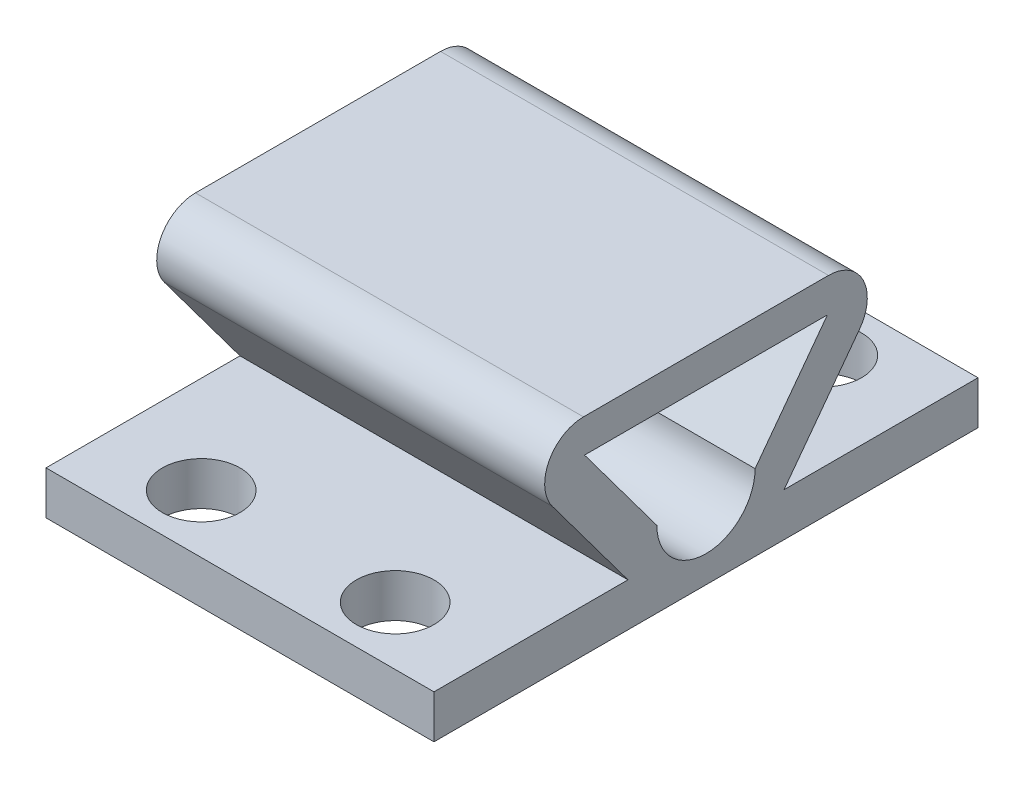
ISO-10303-21;
HEADER;
FILE_DESCRIPTION(('STEP AP214'),'2;1');
FILE_NAME('part.step','',(''),(''),'','','');
FILE_SCHEMA(('AUTOMOTIVE_DESIGN { 1 0 10303 214 1 1 1 1 }'));
ENDSEC;
DATA;
#1=APPLICATION_CONTEXT('core data for automotive mechanical design processes');
#2=APPLICATION_PROTOCOL_DEFINITION('international standard','automotive_design',2000,#1);
#3=PRODUCT_CONTEXT('',#1,'mechanical');
#4=PRODUCT('Part','Part','',(#3));
#5=PRODUCT_RELATED_PRODUCT_CATEGORY('part','',(#4));
#6=PRODUCT_DEFINITION_FORMATION('','',#4);
#7=PRODUCT_DEFINITION_CONTEXT('part definition',#1,'design');
#8=PRODUCT_DEFINITION('design','',#6,#7);
#9=PRODUCT_DEFINITION_SHAPE('','',#8);
#10=(LENGTH_UNIT() NAMED_UNIT(*) SI_UNIT(.MILLI.,.METRE.));
#11=(NAMED_UNIT(*) PLANE_ANGLE_UNIT() SI_UNIT($,.RADIAN.));
#12=(NAMED_UNIT(*) SI_UNIT($,.STERADIAN.) SOLID_ANGLE_UNIT());
#13=UNCERTAINTY_MEASURE_WITH_UNIT(LENGTH_MEASURE(1.E-05),#10,'distance_accuracy_value','');
#14=(GEOMETRIC_REPRESENTATION_CONTEXT(3) GLOBAL_UNCERTAINTY_ASSIGNED_CONTEXT((#13)) GLOBAL_UNIT_ASSIGNED_CONTEXT((#10,
#11,#12)) REPRESENTATION_CONTEXT('',''));
#15=CARTESIAN_POINT('',(0.,0.,0.));
#16=DIRECTION('',(0.,0.,1.));
#17=DIRECTION('',(1.,0.,0.));
#18=AXIS2_PLACEMENT_3D('',#15,#16,#17);
#19=CARTESIAN_POINT('',(25.4,-16.0818556559255,0.));
#20=DIRECTION('',(-1.,0.,0.));
#21=DIRECTION('',(0.,0.,1.));
#22=AXIS2_PLACEMENT_3D('',#19,#20,#21);
#23=CYLINDRICAL_SURFACE('',#22,3.21637113118511);
#24=CARTESIAN_POINT('',(2.54,-16.0818556559255,0.));
#25=DIRECTION('',(1.,0.,0.));
#26=DIRECTION('',(0.,0.,-1.));
#27=AXIS2_PLACEMENT_3D('',#24,#25,#26);
#28=CIRCLE('',#27,3.21637113118511);
#29=CARTESIAN_POINT('',(2.54,-16.0818556559255,3.21637113118511));
#30=VERTEX_POINT('',#29);
#31=CARTESIAN_POINT('',(2.54,-16.0818556559255,-3.21637113118511));
#32=VERTEX_POINT('',#31);
#33=EDGE_CURVE('E138',#30,#32,#28,.T.);
#34=ORIENTED_EDGE('',*,*,#33,.F.);
#35=DIRECTION('',(-1.,0.,0.));
#36=VECTOR('',#35,1.);
#37=CARTESIAN_POINT('',(25.4,-16.0818556559255,3.21637113118511));
#38=LINE('',#37,#36);
#39=CARTESIAN_POINT('',(25.4,-16.0818556559255,3.21637113118511));
#40=VERTEX_POINT('',#39);
#41=EDGE_CURVE('E150',#40,#30,#38,.T.);
#42=ORIENTED_EDGE('',*,*,#41,.F.);
#43=CARTESIAN_POINT('',(25.4,-16.0818556559255,0.));
#44=DIRECTION('',(1.,0.,0.));
#45=DIRECTION('',(0.,0.,-1.));
#46=AXIS2_PLACEMENT_3D('',#43,#44,#45);
#47=CIRCLE('',#46,3.21637113118511);
#48=CARTESIAN_POINT('',(25.4,-16.0818556559255,-3.21637113118511));
#49=VERTEX_POINT('',#48);
#50=EDGE_CURVE('E281',#40,#49,#47,.T.);
#51=ORIENTED_EDGE('',*,*,#50,.T.);
#52=DIRECTION('',(-1.,0.,0.));
#53=VECTOR('',#52,1.);
#54=CARTESIAN_POINT('',(25.4,-16.0818556559255,-3.21637113118511));
#55=LINE('',#54,#53);
#56=EDGE_CURVE('E153',#49,#32,#55,.T.);
#57=ORIENTED_EDGE('',*,*,#56,.T.);
#58=EDGE_LOOP('',(#34,#42,#51,#57));
#59=FACE_BOUND('',#58,.T.);
#60=ADVANCED_FACE('F37',(#59),#23,.F.);
#61=CARTESIAN_POINT('',(25.4,-7.28576497869708,9.77350921006466));
#62=DIRECTION('',(0.,0.597668162753968,-0.801743579475568));
#63=DIRECTION('',(0.,0.801743579475568,0.597668162753968));
#64=AXIS2_PLACEMENT_3D('',#61,#62,#63);
#65=PLANE('',#64);
#66=DIRECTION('',(0.,-0.801743579475568,-0.597668162753968));
#67=VECTOR('',#66,1.);
#68=CARTESIAN_POINT('',(2.54,-9.73185565592554,7.95004525174394));
#69=LINE('',#68,#67);
#70=CARTESIAN_POINT('',(2.54,-9.73185565592554,7.95004525174394));
#71=VERTEX_POINT('',#70);
#72=EDGE_CURVE('E135',#71,#30,#69,.T.);
#73=ORIENTED_EDGE('',*,*,#72,.F.);
#74=DIRECTION('',(-1.,0.,0.));
#75=VECTOR('',#74,1.);
#76=CARTESIAN_POINT('',(25.4,-9.73185565592554,7.95004525174394));
#77=LINE('',#76,#75);
#78=CARTESIAN_POINT('',(25.4,-9.73185565592554,7.95004525174394));
#79=VERTEX_POINT('',#78);
#80=EDGE_CURVE('E161',#79,#71,#77,.T.);
#81=ORIENTED_EDGE('',*,*,#80,.F.);
#82=DIRECTION('',(0.,-0.801743579475568,-0.597668162753968));
#83=VECTOR('',#82,1.);
#84=CARTESIAN_POINT('',(25.4,-7.28576497869708,9.77350921006466));
#85=LINE('',#84,#83);
#86=EDGE_CURVE('E159',#79,#40,#85,.T.);
#87=ORIENTED_EDGE('',*,*,#86,.T.);
#88=ORIENTED_EDGE('',*,*,#41,.T.);
#89=EDGE_LOOP('',(#73,#81,#87,#88));
#90=FACE_BOUND('',#89,.T.);
#91=ADVANCED_FACE('F157',(#90),#65,.T.);
#92=CARTESIAN_POINT('',(25.4,-9.73185565592554,0.));
#93=DIRECTION('',(0.,1.,0.));
#94=DIRECTION('',(0.,0.,1.));
#95=AXIS2_PLACEMENT_3D('',#92,#93,#94);
#96=PLANE('',#95);
#97=ORIENTED_EDGE('',*,*,#80,.T.);
#98=DIRECTION('',(0.,0.,1.));
#99=VECTOR('',#98,1.);
#100=CARTESIAN_POINT('',(2.54,-9.73185565592554,-7.95004525174394));
#101=LINE('',#100,#99);
#102=CARTESIAN_POINT('',(2.54,-9.73185565592554,-7.95004525174394));
#103=VERTEX_POINT('',#102);
#104=EDGE_CURVE('E141',#103,#71,#101,.T.);
#105=ORIENTED_EDGE('',*,*,#104,.F.);
#106=DIRECTION('',(-1.,0.,0.));
#107=VECTOR('',#106,1.);
#108=CARTESIAN_POINT('',(25.4,-9.73185565592554,-7.95004525174394));
#109=LINE('',#108,#107);
#110=CARTESIAN_POINT('',(25.4,-9.73185565592554,-7.95004525174394));
#111=VERTEX_POINT('',#110);
#112=EDGE_CURVE('E166',#111,#103,#109,.T.);
#113=ORIENTED_EDGE('',*,*,#112,.F.);
#114=DIRECTION('',(0.,0.,-1.));
#115=VECTOR('',#114,1.);
#116=CARTESIAN_POINT('',(25.4,-9.73185565592554,0.));
#117=LINE('',#116,#115);
#118=EDGE_CURVE('E245',#79,#111,#117,.T.);
#119=ORIENTED_EDGE('',*,*,#118,.F.);
#120=EDGE_LOOP('',(#97,#105,#113,#119));
#121=FACE_BOUND('',#120,.T.);
#122=ADVANCED_FACE('F244',(#121),#96,.F.);
#123=CARTESIAN_POINT('',(25.4,-8.95826676965895,-12.0170912780576));
#124=DIRECTION('',(0.,-0.597668162753968,-0.801743579475568));
#125=DIRECTION('',(0.,0.801743579475568,-0.597668162753968));
#126=AXIS2_PLACEMENT_3D('',#123,#124,#125);
#127=PLANE('',#126);
#128=DIRECTION('',(0.,-0.801743579475568,0.597668162753968));
#129=VECTOR('',#128,1.);
#130=CARTESIAN_POINT('',(0.,-8.95826676965895,-12.0170912780576));
#131=LINE('',#130,#129);
#132=CARTESIAN_POINT('',(0.,-11.5869322834753,-10.0575249923319));
#133=VERTEX_POINT('',#132);
#134=CARTESIAN_POINT('',(0.,-18.2252363776649,-5.10893156003819));
#135=VERTEX_POINT('',#134);
#136=EDGE_CURVE('E190',#133,#135,#131,.T.);
#137=ORIENTED_EDGE('',*,*,#136,.F.);
#138=DIRECTION('',(-1.,0.,0.));
#139=VECTOR('',#138,1.);
#140=CARTESIAN_POINT('',(25.4,-11.5869322834753,-10.057524992332));
#141=LINE('',#140,#139);
#142=CARTESIAN_POINT('',(25.4,-11.5869322834753,-10.0575249923319));
#143=VERTEX_POINT('',#142);
#144=EDGE_CURVE('E45',#133,#143,#141,.F.);
#145=ORIENTED_EDGE('',*,*,#144,.T.);
#146=DIRECTION('',(0.,-0.801743579475568,0.597668162753968));
#147=VECTOR('',#146,1.);
#148=CARTESIAN_POINT('',(25.4,-8.95826676965895,-12.0170912780576));
#149=LINE('',#148,#147);
#150=CARTESIAN_POINT('',(25.4,-18.2252363776649,-5.10893156003819));
#151=VERTEX_POINT('',#150);
#152=EDGE_CURVE('E236',#143,#151,#149,.T.);
#153=ORIENTED_EDGE('',*,*,#152,.T.);
#154=DIRECTION('',(-1.,0.,0.));
#155=VECTOR('',#154,1.);
#156=CARTESIAN_POINT('',(25.4,-18.2252363776649,-5.10893156003819));
#157=LINE('',#156,#155);
#158=EDGE_CURVE('E170',#151,#135,#157,.T.);
#159=ORIENTED_EDGE('',*,*,#158,.T.);
#160=EDGE_LOOP('',(#137,#145,#153,#159));
#161=FACE_BOUND('',#160,.T.);
#162=ADVANCED_FACE('F332',(#161),#127,.T.);
#163=CARTESIAN_POINT('',(25.4,-7.52885515008018,0.));
#164=DIRECTION('',(0.,1.,0.));
#165=DIRECTION('',(0.,0.,1.));
#166=AXIS2_PLACEMENT_3D('',#163,#164,#165);
#167=PLANE('',#166);
#168=DIRECTION('',(0.,0.,-1.));
#169=VECTOR('',#168,1.);
#170=CARTESIAN_POINT('',(25.4,-7.52885515008018,0.));
#171=LINE('',#170,#169);
#172=CARTESIAN_POINT('',(25.4,-7.52885515008018,8.02109630046401));
#173=VERTEX_POINT('',#172);
#174=CARTESIAN_POINT('',(25.4,-7.52885515008018,-8.02109630046401));
#175=VERTEX_POINT('',#174);
#176=EDGE_CURVE('E212',#173,#175,#171,.T.);
#177=ORIENTED_EDGE('',*,*,#176,.T.);
#178=DIRECTION('',(-1.,0.,0.));
#179=VECTOR('',#178,1.);
#180=CARTESIAN_POINT('',(25.4,-7.52885515008018,-8.02109630046401));
#181=LINE('',#180,#179);
#182=CARTESIAN_POINT('',(0.,-7.52885515008018,-8.02109630046401));
#183=VERTEX_POINT('',#182);
#184=EDGE_CURVE('E201',#175,#183,#181,.T.);
#185=ORIENTED_EDGE('',*,*,#184,.T.);
#186=DIRECTION('',(0.,0.,-1.));
#187=VECTOR('',#186,1.);
#188=CARTESIAN_POINT('',(0.,-7.52885515008018,0.));
#189=LINE('',#188,#187);
#190=CARTESIAN_POINT('',(0.,-7.52885515008018,8.02109630046401));
#191=VERTEX_POINT('',#190);
#192=EDGE_CURVE('E209',#191,#183,#189,.T.);
#193=ORIENTED_EDGE('',*,*,#192,.F.);
#194=DIRECTION('',(-1.,0.,0.));
#195=VECTOR('',#194,1.);
#196=CARTESIAN_POINT('',(25.4,-7.52885515008018,8.02109630046401));
#197=LINE('',#196,#195);
#198=EDGE_CURVE('E197',#191,#173,#197,.F.);
#199=ORIENTED_EDGE('',*,*,#198,.T.);
#200=EDGE_LOOP('',(#177,#185,#193,#199));
#201=FACE_BOUND('',#200,.T.);
#202=ADVANCED_FACE('F208',(#201),#167,.T.);
#203=CARTESIAN_POINT('',(25.4,-8.95826676965895,12.0170912780576));
#204=DIRECTION('',(0.,0.597668162753968,-0.801743579475568));
#205=DIRECTION('',(0.,0.801743579475568,0.597668162753968));
#206=AXIS2_PLACEMENT_3D('',#203,#204,#205);
#207=PLANE('',#206);
#208=DIRECTION('',(0.,-0.801743579475568,-0.597668162753968));
#209=VECTOR('',#208,1.);
#210=CARTESIAN_POINT('',(25.4,-8.95826676965895,12.0170912780576));
#211=LINE('',#210,#209);
#212=CARTESIAN_POINT('',(25.4,-11.5869322834753,10.0575249923319));
#213=VERTEX_POINT('',#212);
#214=CARTESIAN_POINT('',(25.4,-18.2252363776649,5.10893156003819));
#215=VERTEX_POINT('',#214);
#216=EDGE_CURVE('E267',#213,#215,#211,.T.);
#217=ORIENTED_EDGE('',*,*,#216,.F.);
#218=DIRECTION('',(-1.,0.,0.));
#219=VECTOR('',#218,1.);
#220=CARTESIAN_POINT('',(0.,-11.5869322834753,10.0575249923319));
#221=LINE('',#220,#219);
#222=CARTESIAN_POINT('',(0.,-11.5869322834753,10.0575249923319));
#223=VERTEX_POINT('',#222);
#224=EDGE_CURVE('E160',#213,#223,#221,.T.);
#225=ORIENTED_EDGE('',*,*,#224,.T.);
#226=DIRECTION('',(0.,-0.801743579475568,-0.597668162753968));
#227=VECTOR('',#226,1.);
#228=CARTESIAN_POINT('',(0.,-8.95826676965895,12.0170912780576));
#229=LINE('',#228,#227);
#230=CARTESIAN_POINT('',(0.,-18.2252363776649,5.10893156003819));
#231=VERTEX_POINT('',#230);
#232=EDGE_CURVE('E217',#223,#231,#229,.T.);
#233=ORIENTED_EDGE('',*,*,#232,.T.);
#234=DIRECTION('',(-1.,0.,0.));
#235=VECTOR('',#234,1.);
#236=CARTESIAN_POINT('',(25.4,-18.2252363776649,5.10893156003819));
#237=LINE('',#236,#235);
#238=EDGE_CURVE('E184',#215,#231,#237,.T.);
#239=ORIENTED_EDGE('',*,*,#238,.F.);
#240=EDGE_LOOP('',(#217,#225,#233,#239));
#241=FACE_BOUND('',#240,.T.);
#242=ADVANCED_FACE('F325',(#241),#207,.F.);
#243=CARTESIAN_POINT('',(25.4,-18.2252363776649,0.));
#244=DIRECTION('',(0.,-1.,0.));
#245=DIRECTION('',(0.,0.,-1.));
#246=AXIS2_PLACEMENT_3D('',#243,#244,#245);
#247=PLANE('',#246);
#248=CARTESIAN_POINT('',(6.35,-18.2252363776649,13.9989315600382));
#249=DIRECTION('',(0.,1.,0.));
#250=DIRECTION('',(0.,0.,1.));
#251=AXIS2_PLACEMENT_3D('',#248,#249,#250);
#252=CIRCLE('',#251,2.54);
#253=CARTESIAN_POINT('',(6.35,-18.2252363776649,16.5389315600382));
#254=VERTEX_POINT('',#253);
#255=EDGE_CURVE('E194',#254,#254,#252,.T.);
#256=ORIENTED_EDGE('',*,*,#255,.F.);
#257=EDGE_LOOP('',(#256));
#258=FACE_BOUND('',#257,.T.);
#259=CARTESIAN_POINT('',(19.05,-18.2252363776649,13.9989315600382));
#260=DIRECTION('',(0.,1.,0.));
#261=DIRECTION('',(0.,0.,1.));
#262=AXIS2_PLACEMENT_3D('',#259,#260,#261);
#263=CIRCLE('',#262,2.54);
#264=CARTESIAN_POINT('',(19.05,-18.2252363776649,16.5389315600382));
#265=VERTEX_POINT('',#264);
#266=EDGE_CURVE('E191',#265,#265,#263,.T.);
#267=ORIENTED_EDGE('',*,*,#266,.F.);
#268=EDGE_LOOP('',(#267));
#269=FACE_BOUND('',#268,.T.);
#270=DIRECTION('',(0.,0.,1.));
#271=VECTOR('',#270,1.);
#272=CARTESIAN_POINT('',(0.,-18.2252363776649,0.));
#273=LINE('',#272,#271);
#274=CARTESIAN_POINT('',(0.,-18.2252363776649,17.8089315600382));
#275=VERTEX_POINT('',#274);
#276=EDGE_CURVE('E219',#231,#275,#273,.T.);
#277=ORIENTED_EDGE('',*,*,#276,.T.);
#278=DIRECTION('',(-1.,0.,0.));
#279=VECTOR('',#278,1.);
#280=CARTESIAN_POINT('',(25.4,-18.2252363776649,17.8089315600382));
#281=LINE('',#280,#279);
#282=CARTESIAN_POINT('',(25.4,-18.2252363776649,17.8089315600382));
#283=VERTEX_POINT('',#282);
#284=EDGE_CURVE('E181',#283,#275,#281,.T.);
#285=ORIENTED_EDGE('',*,*,#284,.F.);
#286=DIRECTION('',(0.,0.,1.));
#287=VECTOR('',#286,1.);
#288=CARTESIAN_POINT('',(25.4,-18.2252363776649,0.));
#289=LINE('',#288,#287);
#290=EDGE_CURVE('E269',#215,#283,#289,.T.);
#291=ORIENTED_EDGE('',*,*,#290,.F.);
#292=ORIENTED_EDGE('',*,*,#238,.T.);
#293=EDGE_LOOP('',(#277,#285,#291,#292));
#294=FACE_BOUND('',#293,.T.);
#295=ADVANCED_FACE('F321',(#258,#269,#294),#247,.F.);
#296=CARTESIAN_POINT('',(25.4,0.,17.8089315600382));
#297=DIRECTION('',(0.,0.,-1.));
#298=DIRECTION('',(-1.,0.,0.));
#299=AXIS2_PLACEMENT_3D('',#296,#297,#298);
#300=PLANE('',#299);
#301=DIRECTION('',(0.,-1.,0.));
#302=VECTOR('',#301,1.);
#303=CARTESIAN_POINT('',(0.,0.,17.8089315600382));
#304=LINE('',#303,#302);
#305=CARTESIAN_POINT('',(0.,-21.0616456549118,17.8089315600382));
#306=VERTEX_POINT('',#305);
#307=EDGE_CURVE('E225',#275,#306,#304,.T.);
#308=ORIENTED_EDGE('',*,*,#307,.T.);
#309=DIRECTION('',(-1.,0.,0.));
#310=VECTOR('',#309,1.);
#311=CARTESIAN_POINT('',(25.4,-21.0616456549118,17.8089315600382));
#312=LINE('',#311,#310);
#313=CARTESIAN_POINT('',(25.4,-21.0616456549118,17.8089315600382));
#314=VERTEX_POINT('',#313);
#315=EDGE_CURVE('E178',#314,#306,#312,.T.);
#316=ORIENTED_EDGE('',*,*,#315,.F.);
#317=DIRECTION('',(0.,-1.,0.));
#318=VECTOR('',#317,1.);
#319=CARTESIAN_POINT('',(25.4,0.,17.8089315600382));
#320=LINE('',#319,#318);
#321=EDGE_CURVE('E271',#283,#314,#320,.T.);
#322=ORIENTED_EDGE('',*,*,#321,.F.);
#323=ORIENTED_EDGE('',*,*,#284,.T.);
#324=EDGE_LOOP('',(#308,#316,#322,#323));
#325=FACE_BOUND('',#324,.T.);
#326=ADVANCED_FACE('F317',(#325),#300,.F.);
#327=CARTESIAN_POINT('',(25.4,-21.0616456549118,0.));
#328=DIRECTION('',(0.,1.,0.));
#329=DIRECTION('',(0.,0.,1.));
#330=AXIS2_PLACEMENT_3D('',#327,#328,#329);
#331=PLANE('',#330);
#332=CARTESIAN_POINT('',(6.35,-21.0616456549118,-13.9989315600382));
#333=DIRECTION('',(0.,1.,0.));
#334=DIRECTION('',(0.,0.,1.));
#335=AXIS2_PLACEMENT_3D('',#332,#333,#334);
#336=CIRCLE('',#335,2.54);
#337=CARTESIAN_POINT('',(6.35,-21.0616456549118,-11.4589315600382));
#338=VERTEX_POINT('',#337);
#339=EDGE_CURVE('E249',#338,#338,#336,.T.);
#340=ORIENTED_EDGE('',*,*,#339,.T.);
#341=EDGE_LOOP('',(#340));
#342=FACE_BOUND('',#341,.T.);
#343=CARTESIAN_POINT('',(19.05,-21.0616456549118,-13.9989315600382));
#344=DIRECTION('',(0.,1.,0.));
#345=DIRECTION('',(0.,0.,1.));
#346=AXIS2_PLACEMENT_3D('',#343,#344,#345);
#347=CIRCLE('',#346,2.54);
#348=CARTESIAN_POINT('',(19.05,-21.0616456549118,-11.4589315600382));
#349=VERTEX_POINT('',#348);
#350=EDGE_CURVE('E258',#349,#349,#347,.T.);
#351=ORIENTED_EDGE('',*,*,#350,.T.);
#352=EDGE_LOOP('',(#351));
#353=FACE_BOUND('',#352,.T.);
#354=CARTESIAN_POINT('',(6.35,-21.0616456549118,13.9989315600382));
#355=DIRECTION('',(0.,1.,0.));
#356=DIRECTION('',(0.,0.,1.));
#357=AXIS2_PLACEMENT_3D('',#354,#355,#356);
#358=CIRCLE('',#357,2.54);
#359=CARTESIAN_POINT('',(6.35,-21.0616456549118,16.5389315600382));
#360=VERTEX_POINT('',#359);
#361=EDGE_CURVE('E192',#360,#360,#358,.T.);
#362=ORIENTED_EDGE('',*,*,#361,.T.);
#363=EDGE_LOOP('',(#362));
#364=FACE_BOUND('',#363,.T.);
#365=CARTESIAN_POINT('',(19.05,-21.0616456549118,13.9989315600382));
#366=DIRECTION('',(0.,1.,0.));
#367=DIRECTION('',(0.,0.,1.));
#368=AXIS2_PLACEMENT_3D('',#365,#366,#367);
#369=CIRCLE('',#368,2.54);
#370=CARTESIAN_POINT('',(19.05,-21.0616456549118,16.5389315600382));
#371=VERTEX_POINT('',#370);
#372=EDGE_CURVE('E187',#371,#371,#369,.T.);
#373=ORIENTED_EDGE('',*,*,#372,.T.);
#374=EDGE_LOOP('',(#373));
#375=FACE_BOUND('',#374,.T.);
#376=DIRECTION('',(0.,0.,-1.));
#377=VECTOR('',#376,1.);
#378=CARTESIAN_POINT('',(0.,-21.0616456549118,0.));
#379=LINE('',#378,#377);
#380=CARTESIAN_POINT('',(0.,-21.0616456549118,-17.8089315600382));
#381=VERTEX_POINT('',#380);
#382=EDGE_CURVE('E227',#306,#381,#379,.T.);
#383=ORIENTED_EDGE('',*,*,#382,.T.);
#384=DIRECTION('',(-1.,0.,0.));
#385=VECTOR('',#384,1.);
#386=CARTESIAN_POINT('',(25.4,-21.0616456549118,-17.8089315600382));
#387=LINE('',#386,#385);
#388=CARTESIAN_POINT('',(25.4,-21.0616456549118,-17.8089315600382));
#389=VERTEX_POINT('',#388);
#390=EDGE_CURVE('E176',#389,#381,#387,.T.);
#391=ORIENTED_EDGE('',*,*,#390,.F.);
#392=DIRECTION('',(0.,0.,-1.));
#393=VECTOR('',#392,1.);
#394=CARTESIAN_POINT('',(25.4,-21.0616456549118,0.));
#395=LINE('',#394,#393);
#396=EDGE_CURVE('E273',#314,#389,#395,.T.);
#397=ORIENTED_EDGE('',*,*,#396,.F.);
#398=ORIENTED_EDGE('',*,*,#315,.T.);
#399=EDGE_LOOP('',(#383,#391,#397,#398));
#400=FACE_BOUND('',#399,.T.);
#401=ADVANCED_FACE('F313',(#342,#353,#364,#375,#400),#331,.F.);
#402=CARTESIAN_POINT('',(25.4,0.,-17.8089315600382));
#403=DIRECTION('',(0.,0.,-1.));
#404=DIRECTION('',(-1.,0.,0.));
#405=AXIS2_PLACEMENT_3D('',#402,#403,#404);
#406=PLANE('',#405);
#407=DIRECTION('',(0.,-1.,0.));
#408=VECTOR('',#407,1.);
#409=CARTESIAN_POINT('',(0.,0.,-17.8089315600382));
#410=LINE('',#409,#408);
#411=CARTESIAN_POINT('',(0.,-18.2252363776649,-17.8089315600382));
#412=VERTEX_POINT('',#411);
#413=EDGE_CURVE('E230',#412,#381,#410,.T.);
#414=ORIENTED_EDGE('',*,*,#413,.F.);
#415=DIRECTION('',(-1.,0.,0.));
#416=VECTOR('',#415,1.);
#417=CARTESIAN_POINT('',(25.4,-18.2252363776649,-17.8089315600382));
#418=LINE('',#417,#416);
#419=CARTESIAN_POINT('',(25.4,-18.2252363776649,-17.8089315600382));
#420=VERTEX_POINT('',#419);
#421=EDGE_CURVE('E173',#420,#412,#418,.T.);
#422=ORIENTED_EDGE('',*,*,#421,.F.);
#423=DIRECTION('',(0.,-1.,0.));
#424=VECTOR('',#423,1.);
#425=CARTESIAN_POINT('',(25.4,0.,-17.8089315600382));
#426=LINE('',#425,#424);
#427=EDGE_CURVE('E275',#420,#389,#426,.T.);
#428=ORIENTED_EDGE('',*,*,#427,.T.);
#429=ORIENTED_EDGE('',*,*,#390,.T.);
#430=EDGE_LOOP('',(#414,#422,#428,#429));
#431=FACE_BOUND('',#430,.T.);
#432=ADVANCED_FACE('F309',(#431),#406,.T.);
#433=CARTESIAN_POINT('',(25.4,-18.2252363776649,0.));
#434=DIRECTION('',(0.,1.,0.));
#435=DIRECTION('',(0.,0.,1.));
#436=AXIS2_PLACEMENT_3D('',#433,#434,#435);
#437=PLANE('',#436);
#438=CARTESIAN_POINT('',(6.35,-18.2252363776649,-13.9989315600382));
#439=DIRECTION('',(0.,1.,0.));
#440=DIRECTION('',(0.,0.,1.));
#441=AXIS2_PLACEMENT_3D('',#438,#439,#440);
#442=CIRCLE('',#441,2.54);
#443=CARTESIAN_POINT('',(6.35,-18.2252363776649,-11.4589315600382));
#444=VERTEX_POINT('',#443);
#445=EDGE_CURVE('E246',#444,#444,#442,.T.);
#446=ORIENTED_EDGE('',*,*,#445,.F.);
#447=EDGE_LOOP('',(#446));
#448=FACE_BOUND('',#447,.T.);
#449=CARTESIAN_POINT('',(19.05,-18.2252363776649,-13.9989315600382));
#450=DIRECTION('',(0.,1.,0.));
#451=DIRECTION('',(0.,0.,1.));
#452=AXIS2_PLACEMENT_3D('',#449,#450,#451);
#453=CIRCLE('',#452,2.54);
#454=CARTESIAN_POINT('',(19.05,-18.2252363776649,-11.4589315600382));
#455=VERTEX_POINT('',#454);
#456=EDGE_CURVE('E255',#455,#455,#453,.T.);
#457=ORIENTED_EDGE('',*,*,#456,.F.);
#458=EDGE_LOOP('',(#457));
#459=FACE_BOUND('',#458,.T.);
#460=DIRECTION('',(0.,0.,-1.));
#461=VECTOR('',#460,1.);
#462=CARTESIAN_POINT('',(0.,-18.2252363776649,0.));
#463=LINE('',#462,#461);
#464=EDGE_CURVE('E233',#135,#412,#463,.T.);
#465=ORIENTED_EDGE('',*,*,#464,.F.);
#466=ORIENTED_EDGE('',*,*,#158,.F.);
#467=DIRECTION('',(0.,0.,-1.));
#468=VECTOR('',#467,1.);
#469=CARTESIAN_POINT('',(25.4,-18.2252363776649,0.));
#470=LINE('',#469,#468);
#471=EDGE_CURVE('E278',#151,#420,#470,.T.);
#472=ORIENTED_EDGE('',*,*,#471,.T.);
#473=ORIENTED_EDGE('',*,*,#421,.T.);
#474=EDGE_LOOP('',(#465,#466,#472,#473));
#475=FACE_BOUND('',#474,.T.);
#476=ADVANCED_FACE('F296',(#448,#459,#475),#437,.T.);
#477=CARTESIAN_POINT('',(25.4,-7.28576497869708,-9.77350921006466));
#478=DIRECTION('',(0.,-0.597668162753968,-0.801743579475568));
#479=DIRECTION('',(0.,0.801743579475568,-0.597668162753968));
#480=AXIS2_PLACEMENT_3D('',#477,#478,#479);
#481=PLANE('',#480);
#482=ORIENTED_EDGE('',*,*,#112,.T.);
#483=DIRECTION('',(0.,-0.801743579475568,0.597668162753968));
#484=VECTOR('',#483,1.);
#485=CARTESIAN_POINT('',(2.54,-9.73185565592554,-7.95004525174394));
#486=LINE('',#485,#484);
#487=EDGE_CURVE('E154',#103,#32,#486,.T.);
#488=ORIENTED_EDGE('',*,*,#487,.T.);
#489=ORIENTED_EDGE('',*,*,#56,.F.);
#490=DIRECTION('',(0.,-0.801743579475568,0.597668162753968));
#491=VECTOR('',#490,1.);
#492=CARTESIAN_POINT('',(25.4,-7.28576497869708,-9.77350921006466));
#493=LINE('',#492,#491);
#494=EDGE_CURVE('E174',#111,#49,#493,.T.);
#495=ORIENTED_EDGE('',*,*,#494,.F.);
#496=EDGE_LOOP('',(#482,#488,#489,#495));
#497=FACE_BOUND('',#496,.T.);
#498=ADVANCED_FACE('F240',(#497),#481,.F.);
#499=CARTESIAN_POINT('',(25.4,0.,0.));
#500=DIRECTION('',(1.,0.,0.));
#501=DIRECTION('',(0.,0.,-1.));
#502=AXIS2_PLACEMENT_3D('',#499,#500,#501);
#503=PLANE('',#502);
#504=ORIENTED_EDGE('',*,*,#152,.F.);
#505=CARTESIAN_POINT('',(25.4,-10.0688551500802,-8.02109630046401));
#506=DIRECTION('',(1.,0.,0.));
#507=DIRECTION('',(0.,0.,-1.));
#508=AXIS2_PLACEMENT_3D('',#505,#506,#507);
#509=CIRCLE('',#508,2.54);
#510=EDGE_CURVE('E11',#143,#175,#509,.T.);
#511=ORIENTED_EDGE('',*,*,#510,.T.);
#512=ORIENTED_EDGE('',*,*,#176,.F.);
#513=CARTESIAN_POINT('',(25.4,-10.0688551500802,8.02109630046401));
#514=DIRECTION('',(1.,0.,0.));
#515=DIRECTION('',(0.,0.,-1.));
#516=AXIS2_PLACEMENT_3D('',#513,#514,#515);
#517=CIRCLE('',#516,2.54);
#518=EDGE_CURVE('E199',#173,#213,#517,.T.);
#519=ORIENTED_EDGE('',*,*,#518,.T.);
#520=ORIENTED_EDGE('',*,*,#216,.T.);
#521=ORIENTED_EDGE('',*,*,#290,.T.);
#522=ORIENTED_EDGE('',*,*,#321,.T.);
#523=ORIENTED_EDGE('',*,*,#396,.T.);
#524=ORIENTED_EDGE('',*,*,#427,.F.);
#525=ORIENTED_EDGE('',*,*,#471,.F.);
#526=EDGE_LOOP('',(#504,#511,#512,#519,#520,#521,#522,#523,#524,#525));
#527=FACE_BOUND('',#526,.T.);
#528=ORIENTED_EDGE('',*,*,#50,.F.);
#529=ORIENTED_EDGE('',*,*,#86,.F.);
#530=ORIENTED_EDGE('',*,*,#118,.T.);
#531=ORIENTED_EDGE('',*,*,#494,.T.);
#532=EDGE_LOOP('',(#528,#529,#530,#531));
#533=FACE_BOUND('',#532,.T.);
#534=ADVANCED_FACE('F285',(#527,#533),#503,.T.);
#535=CARTESIAN_POINT('',(0.,0.,0.));
#536=DIRECTION('',(1.,0.,0.));
#537=DIRECTION('',(0.,0.,-1.));
#538=AXIS2_PLACEMENT_3D('',#535,#536,#537);
#539=PLANE('',#538);
#540=CARTESIAN_POINT('',(0.,-16.0818556559255,0.));
#541=DIRECTION('',(-1.,0.,0.));
#542=DIRECTION('',(0.,0.,1.));
#543=AXIS2_PLACEMENT_3D('',#540,#541,#542);
#544=CIRCLE('',#543,3.175);
#545=CARTESIAN_POINT('',(0.,-16.0818556559255,3.175));
#546=VERTEX_POINT('',#545);
#547=EDGE_CURVE('E492',#546,#546,#544,.T.);
#548=ORIENTED_EDGE('',*,*,#547,.F.);
#549=EDGE_LOOP('',(#548));
#550=FACE_BOUND('',#549,.T.);
#551=ORIENTED_EDGE('',*,*,#192,.T.);
#552=CARTESIAN_POINT('',(0.,-10.0688551500802,-8.02109630046401));
#553=DIRECTION('',(1.,0.,0.));
#554=DIRECTION('',(0.,0.,-1.));
#555=AXIS2_PLACEMENT_3D('',#552,#553,#554);
#556=CIRCLE('',#555,2.54);
#557=EDGE_CURVE('E59',#183,#133,#556,.F.);
#558=ORIENTED_EDGE('',*,*,#557,.T.);
#559=ORIENTED_EDGE('',*,*,#136,.T.);
#560=ORIENTED_EDGE('',*,*,#464,.T.);
#561=ORIENTED_EDGE('',*,*,#413,.T.);
#562=ORIENTED_EDGE('',*,*,#382,.F.);
#563=ORIENTED_EDGE('',*,*,#307,.F.);
#564=ORIENTED_EDGE('',*,*,#276,.F.);
#565=ORIENTED_EDGE('',*,*,#232,.F.);
#566=CARTESIAN_POINT('',(0.,-10.0688551500802,8.02109630046401));
#567=DIRECTION('',(1.,0.,0.));
#568=DIRECTION('',(0.,0.,-1.));
#569=AXIS2_PLACEMENT_3D('',#566,#567,#568);
#570=CIRCLE('',#569,2.54);
#571=EDGE_CURVE('E164',#223,#191,#570,.F.);
#572=ORIENTED_EDGE('',*,*,#571,.T.);
#573=EDGE_LOOP('',(#551,#558,#559,#560,#561,#562,#563,#564,#565,#572));
#574=FACE_BOUND('',#573,.T.);
#575=ADVANCED_FACE('F215',(#550,#574),#539,.F.);
#576=CARTESIAN_POINT('',(19.05,-24.5752363776649,13.9989315600382));
#577=DIRECTION('',(0.,1.,0.));
#578=DIRECTION('',(0.,0.,1.));
#579=AXIS2_PLACEMENT_3D('',#576,#577,#578);
#580=CYLINDRICAL_SURFACE('',#579,2.54);
#581=ORIENTED_EDGE('',*,*,#266,.T.);
#582=EDGE_LOOP('',(#581));
#583=FACE_BOUND('',#582,.T.);
#584=ORIENTED_EDGE('',*,*,#372,.F.);
#585=EDGE_LOOP('',(#584));
#586=FACE_BOUND('',#585,.T.);
#587=ADVANCED_FACE('F293',(#583,#586),#580,.F.);
#588=CARTESIAN_POINT('',(6.35,-24.5752363776649,13.9989315600382));
#589=DIRECTION('',(0.,1.,0.));
#590=DIRECTION('',(0.,0.,1.));
#591=AXIS2_PLACEMENT_3D('',#588,#589,#590);
#592=CYLINDRICAL_SURFACE('',#591,2.54);
#593=ORIENTED_EDGE('',*,*,#255,.T.);
#594=EDGE_LOOP('',(#593));
#595=FACE_BOUND('',#594,.T.);
#596=ORIENTED_EDGE('',*,*,#361,.F.);
#597=EDGE_LOOP('',(#596));
#598=FACE_BOUND('',#597,.T.);
#599=ADVANCED_FACE('F377',(#595,#598),#592,.F.);
#600=CARTESIAN_POINT('',(19.05,-24.5752363776649,-13.9989315600382));
#601=DIRECTION('',(0.,1.,0.));
#602=DIRECTION('',(0.,0.,1.));
#603=AXIS2_PLACEMENT_3D('',#600,#601,#602);
#604=CYLINDRICAL_SURFACE('',#603,2.54);
#605=ORIENTED_EDGE('',*,*,#456,.T.);
#606=EDGE_LOOP('',(#605));
#607=FACE_BOUND('',#606,.T.);
#608=ORIENTED_EDGE('',*,*,#350,.F.);
#609=EDGE_LOOP('',(#608));
#610=FACE_BOUND('',#609,.T.);
#611=ADVANCED_FACE('F369',(#607,#610),#604,.F.);
#612=CARTESIAN_POINT('',(6.35,-24.5752363776649,-13.9989315600382));
#613=DIRECTION('',(0.,1.,0.));
#614=DIRECTION('',(0.,0.,1.));
#615=AXIS2_PLACEMENT_3D('',#612,#613,#614);
#616=CYLINDRICAL_SURFACE('',#615,2.54);
#617=ORIENTED_EDGE('',*,*,#445,.T.);
#618=EDGE_LOOP('',(#617));
#619=FACE_BOUND('',#618,.T.);
#620=ORIENTED_EDGE('',*,*,#339,.F.);
#621=EDGE_LOOP('',(#620));
#622=FACE_BOUND('',#621,.T.);
#623=ADVANCED_FACE('F342',(#619,#622),#616,.F.);
#624=CARTESIAN_POINT('',(2.54,-16.0818556559255,0.));
#625=DIRECTION('',(1.,0.,0.));
#626=DIRECTION('',(0.,0.,-1.));
#627=AXIS2_PLACEMENT_3D('',#624,#625,#626);
#628=PLANE('',#627);
#629=CARTESIAN_POINT('',(2.54,-16.0818556559255,0.));
#630=DIRECTION('',(-1.,0.,0.));
#631=DIRECTION('',(0.,0.,1.));
#632=AXIS2_PLACEMENT_3D('',#629,#630,#631);
#633=CIRCLE('',#632,3.175);
#634=CARTESIAN_POINT('',(2.54,-16.0818556559255,3.175));
#635=VERTEX_POINT('',#634);
#636=EDGE_CURVE('E145',#635,#635,#633,.T.);
#637=ORIENTED_EDGE('',*,*,#636,.T.);
#638=EDGE_LOOP('',(#637));
#639=FACE_BOUND('',#638,.T.);
#640=ORIENTED_EDGE('',*,*,#72,.T.);
#641=ORIENTED_EDGE('',*,*,#33,.T.);
#642=ORIENTED_EDGE('',*,*,#487,.F.);
#643=ORIENTED_EDGE('',*,*,#104,.T.);
#644=EDGE_LOOP('',(#640,#641,#642,#643));
#645=FACE_BOUND('',#644,.T.);
#646=ADVANCED_FACE('F137',(#639,#645),#628,.T.);
#647=CARTESIAN_POINT('',(25.4,-10.0688551500802,8.02109630046401));
#648=DIRECTION('',(1.,0.,0.));
#649=DIRECTION('',(0.,0.,-1.));
#650=AXIS2_PLACEMENT_3D('',#647,#648,#649);
#651=CYLINDRICAL_SURFACE('',#650,2.54);
#652=ORIENTED_EDGE('',*,*,#518,.F.);
#653=ORIENTED_EDGE('',*,*,#198,.F.);
#654=ORIENTED_EDGE('',*,*,#571,.F.);
#655=ORIENTED_EDGE('',*,*,#224,.F.);
#656=EDGE_LOOP('',(#652,#653,#654,#655));
#657=FACE_BOUND('',#656,.T.);
#658=ADVANCED_FACE('F334',(#657),#651,.T.);
#659=CARTESIAN_POINT('',(25.4,-10.0688551500802,-8.02109630046401));
#660=DIRECTION('',(-1.,0.,0.));
#661=DIRECTION('',(0.,0.,1.));
#662=AXIS2_PLACEMENT_3D('',#659,#660,#661);
#663=CYLINDRICAL_SURFACE('',#662,2.54);
#664=ORIENTED_EDGE('',*,*,#510,.F.);
#665=ORIENTED_EDGE('',*,*,#144,.F.);
#666=ORIENTED_EDGE('',*,*,#557,.F.);
#667=ORIENTED_EDGE('',*,*,#184,.F.);
#668=EDGE_LOOP('',(#664,#665,#666,#667));
#669=FACE_BOUND('',#668,.T.);
#670=ADVANCED_FACE('F39',(#669),#663,.T.);
#671=CARTESIAN_POINT('',(2.54,-16.0818556559255,0.));
#672=DIRECTION('',(-1.,0.,0.));
#673=DIRECTION('',(0.,0.,1.));
#674=AXIS2_PLACEMENT_3D('',#671,#672,#673);
#675=CYLINDRICAL_SURFACE('',#674,3.175);
#676=ORIENTED_EDGE('',*,*,#636,.F.);
#677=EDGE_LOOP('',(#676));
#678=FACE_BOUND('',#677,.T.);
#679=ORIENTED_EDGE('',*,*,#547,.T.);
#680=EDGE_LOOP('',(#679));
#681=FACE_BOUND('',#680,.T.);
#682=ADVANCED_FACE('F341',(#678,#681),#675,.F.);
#683=CLOSED_SHELL('',(#60,#91,#122,#162,#202,#242,#295,#326,#401,#432,#476,#498,#534,#575,#587,
#599,#611,#623,#646,#658,#670,#682));
#684=MANIFOLD_SOLID_BREP('B2',#683);
#685=ADVANCED_BREP_SHAPE_REPRESENTATION('',(#18,#684),#14);
#686=SHAPE_DEFINITION_REPRESENTATION(#9,#685);
ENDSEC;
END-ISO-10303-21;
